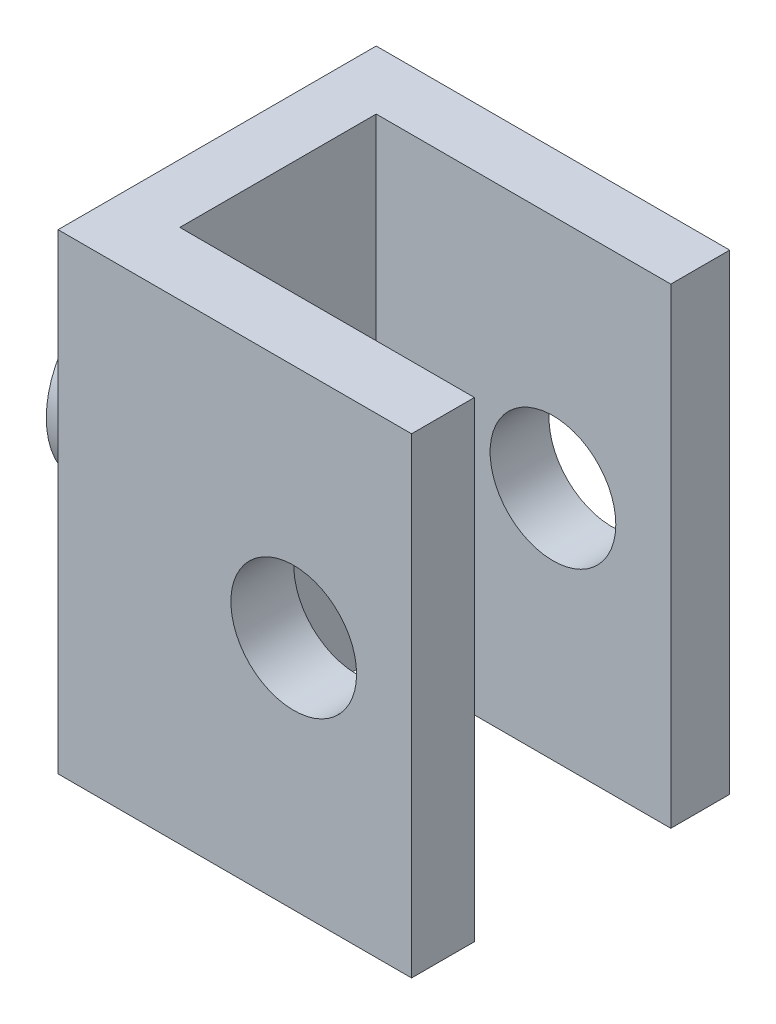
ISO-10303-21;
HEADER;
FILE_DESCRIPTION(('STEP AP214'),'2;1');
FILE_NAME('part.step','',(''),(''),'','','');
FILE_SCHEMA(('AUTOMOTIVE_DESIGN { 1 0 10303 214 1 1 1 1 }'));
ENDSEC;
DATA;
#1=APPLICATION_CONTEXT('core data for automotive mechanical design processes');
#2=APPLICATION_PROTOCOL_DEFINITION('international standard','automotive_design',2000,#1);
#3=PRODUCT_CONTEXT('',#1,'mechanical');
#4=PRODUCT('Part','Part','',(#3));
#5=PRODUCT_RELATED_PRODUCT_CATEGORY('part','',(#4));
#6=PRODUCT_DEFINITION_FORMATION('','',#4);
#7=PRODUCT_DEFINITION_CONTEXT('part definition',#1,'design');
#8=PRODUCT_DEFINITION('design','',#6,#7);
#9=PRODUCT_DEFINITION_SHAPE('','',#8);
#10=(LENGTH_UNIT() NAMED_UNIT(*) SI_UNIT(.MILLI.,.METRE.));
#11=(NAMED_UNIT(*) PLANE_ANGLE_UNIT() SI_UNIT($,.RADIAN.));
#12=(NAMED_UNIT(*) SI_UNIT($,.STERADIAN.) SOLID_ANGLE_UNIT());
#13=UNCERTAINTY_MEASURE_WITH_UNIT(LENGTH_MEASURE(1.E-05),#10,'distance_accuracy_value','');
#14=(GEOMETRIC_REPRESENTATION_CONTEXT(3) GLOBAL_UNCERTAINTY_ASSIGNED_CONTEXT((#13)) GLOBAL_UNIT_ASSIGNED_CONTEXT((#10,
#11,#12)) REPRESENTATION_CONTEXT('',''));
#15=CARTESIAN_POINT('',(0.,0.,0.));
#16=DIRECTION('',(0.,0.,1.));
#17=DIRECTION('',(1.,0.,0.));
#18=AXIS2_PLACEMENT_3D('',#15,#16,#17);
#19=CARTESIAN_POINT('',(-40.7916512459885,-18.,19.1));
#20=DIRECTION('',(-1.,0.,0.));
#21=DIRECTION('',(0.,0.,1.));
#22=AXIS2_PLACEMENT_3D('',#19,#20,#21);
#23=PLANE('',#22);
#24=DIRECTION('',(0.,1.,0.));
#25=VECTOR('',#24,1.);
#26=CARTESIAN_POINT('',(-40.7916512459885,-18.,17.5));
#27=LINE('',#26,#25);
#28=CARTESIAN_POINT('',(-40.7916512459885,-18.,17.5));
#29=VERTEX_POINT('',#28);
#30=CARTESIAN_POINT('',(-40.7916512459885,-6.,17.5));
#31=VERTEX_POINT('',#30);
#32=EDGE_CURVE('E59',#29,#31,#27,.T.);
#33=ORIENTED_EDGE('',*,*,#32,.F.);
#34=DIRECTION('',(0.,0.,-1.));
#35=VECTOR('',#34,1.);
#36=CARTESIAN_POINT('',(-40.7916512459885,-18.,19.1));
#37=LINE('',#36,#35);
#38=CARTESIAN_POINT('',(-40.7916512459885,-18.,12.5));
#39=VERTEX_POINT('',#38);
#40=EDGE_CURVE('E173',#29,#39,#37,.T.);
#41=ORIENTED_EDGE('',*,*,#40,.T.);
#42=DIRECTION('',(0.,1.,0.));
#43=VECTOR('',#42,1.);
#44=CARTESIAN_POINT('',(-40.7916512459885,-18.,12.5));
#45=LINE('',#44,#43);
#46=CARTESIAN_POINT('',(-40.7916512459885,-6.,12.5));
#47=VERTEX_POINT('',#46);
#48=EDGE_CURVE('E49',#39,#47,#45,.T.);
#49=ORIENTED_EDGE('',*,*,#48,.T.);
#50=DIRECTION('',(0.,0.,-1.));
#51=VECTOR('',#50,1.);
#52=CARTESIAN_POINT('',(-40.7916512459885,-6.,19.1));
#53=LINE('',#52,#51);
#54=EDGE_CURVE('E63',#31,#47,#53,.T.);
#55=ORIENTED_EDGE('',*,*,#54,.F.);
#56=EDGE_LOOP('',(#33,#41,#49,#55));
#57=FACE_BOUND('',#56,.T.);
#58=ADVANCED_FACE('F41',(#57),#23,.F.);
#59=CARTESIAN_POINT('',(-42.2916512459885,-6.,19.1));
#60=DIRECTION('',(1.,0.,0.));
#61=DIRECTION('',(0.,0.,-1.));
#62=AXIS2_PLACEMENT_3D('',#59,#60,#61);
#63=PLANE('',#62);
#64=CARTESIAN_POINT('',(-42.2916512459885,-12.,15.));
#65=DIRECTION('',(1.,0.,0.));
#66=DIRECTION('',(0.,0.,-1.));
#67=AXIS2_PLACEMENT_3D('',#64,#65,#66);
#68=CIRCLE('',#67,2.4);
#69=CARTESIAN_POINT('',(-42.2916512459885,-12.,12.6));
#70=VERTEX_POINT('',#69);
#71=EDGE_CURVE('E11',#70,#70,#68,.F.);
#72=ORIENTED_EDGE('',*,*,#71,.F.);
#73=EDGE_LOOP('',(#72));
#74=FACE_BOUND('',#73,.T.);
#75=DIRECTION('',(0.,-1.,0.));
#76=VECTOR('',#75,1.);
#77=CARTESIAN_POINT('',(-42.2916512459885,-6.,11.));
#78=LINE('',#77,#76);
#79=CARTESIAN_POINT('',(-42.2916512459885,-6.,11.));
#80=VERTEX_POINT('',#79);
#81=CARTESIAN_POINT('',(-42.2916512459885,-18.,11.));
#82=VERTEX_POINT('',#81);
#83=EDGE_CURVE('E159',#80,#82,#78,.T.);
#84=ORIENTED_EDGE('',*,*,#83,.T.);
#85=DIRECTION('',(0.,0.,-1.));
#86=VECTOR('',#85,1.);
#87=CARTESIAN_POINT('',(-42.2916512459885,-18.,19.1));
#88=LINE('',#87,#86);
#89=CARTESIAN_POINT('',(-42.2916512459885,-18.,19.1));
#90=VERTEX_POINT('',#89);
#91=EDGE_CURVE('E174',#90,#82,#88,.T.);
#92=ORIENTED_EDGE('',*,*,#91,.F.);
#93=DIRECTION('',(0.,-1.,0.));
#94=VECTOR('',#93,1.);
#95=CARTESIAN_POINT('',(-42.2916512459885,-6.,19.1));
#96=LINE('',#95,#94);
#97=CARTESIAN_POINT('',(-42.2916512459885,-6.,19.1));
#98=VERTEX_POINT('',#97);
#99=EDGE_CURVE('E116',#98,#90,#96,.T.);
#100=ORIENTED_EDGE('',*,*,#99,.F.);
#101=DIRECTION('',(0.,0.,-1.));
#102=VECTOR('',#101,1.);
#103=CARTESIAN_POINT('',(-42.2916512459885,-6.,19.1));
#104=LINE('',#103,#102);
#105=EDGE_CURVE('E165',#98,#80,#104,.T.);
#106=ORIENTED_EDGE('',*,*,#105,.T.);
#107=EDGE_LOOP('',(#84,#92,#100,#106));
#108=FACE_BOUND('',#107,.T.);
#109=ADVANCED_FACE('F43',(#74,#108),#63,.F.);
#110=CARTESIAN_POINT('',(-42.2916512459885,-18.,19.1));
#111=DIRECTION('',(0.,1.,0.));
#112=DIRECTION('',(0.,0.,1.));
#113=AXIS2_PLACEMENT_3D('',#110,#111,#112);
#114=PLANE('',#113);
#115=ORIENTED_EDGE('',*,*,#40,.F.);
#116=DIRECTION('',(1.,0.,0.));
#117=VECTOR('',#116,1.);
#118=CARTESIAN_POINT('',(-40.8916512459885,-18.,17.5));
#119=LINE('',#118,#117);
#120=CARTESIAN_POINT('',(-33.2916512459885,-18.,17.5));
#121=VERTEX_POINT('',#120);
#122=EDGE_CURVE('E127',#29,#121,#119,.T.);
#123=ORIENTED_EDGE('',*,*,#122,.T.);
#124=DIRECTION('',(0.,0.,-1.));
#125=VECTOR('',#124,1.);
#126=CARTESIAN_POINT('',(-33.2916512459885,-18.,19.1));
#127=LINE('',#126,#125);
#128=CARTESIAN_POINT('',(-33.2916512459885,-18.,19.1));
#129=VERTEX_POINT('',#128);
#130=EDGE_CURVE('E124',#129,#121,#127,.T.);
#131=ORIENTED_EDGE('',*,*,#130,.F.);
#132=DIRECTION('',(1.,0.,0.));
#133=VECTOR('',#132,1.);
#134=CARTESIAN_POINT('',(-42.2916512459885,-18.,19.1));
#135=LINE('',#134,#133);
#136=EDGE_CURVE('E107',#90,#129,#135,.T.);
#137=ORIENTED_EDGE('',*,*,#136,.F.);
#138=ORIENTED_EDGE('',*,*,#91,.T.);
#139=DIRECTION('',(1.,0.,0.));
#140=VECTOR('',#139,1.);
#141=CARTESIAN_POINT('',(-42.2916512459885,-18.,11.));
#142=LINE('',#141,#140);
#143=CARTESIAN_POINT('',(-33.2916512459885,-18.,11.));
#144=VERTEX_POINT('',#143);
#145=EDGE_CURVE('E170',#82,#144,#142,.T.);
#146=ORIENTED_EDGE('',*,*,#145,.T.);
#147=DIRECTION('',(0.,0.,-1.));
#148=VECTOR('',#147,1.);
#149=CARTESIAN_POINT('',(-33.2916512459885,-18.,12.5));
#150=LINE('',#149,#148);
#151=CARTESIAN_POINT('',(-33.2916512459885,-18.,12.5));
#152=VERTEX_POINT('',#151);
#153=EDGE_CURVE('E160',#152,#144,#150,.T.);
#154=ORIENTED_EDGE('',*,*,#153,.F.);
#155=DIRECTION('',(1.,0.,0.));
#156=VECTOR('',#155,1.);
#157=CARTESIAN_POINT('',(-40.8916512459885,-18.,12.5));
#158=LINE('',#157,#156);
#159=EDGE_CURVE('E147',#39,#152,#158,.T.);
#160=ORIENTED_EDGE('',*,*,#159,.F.);
#161=EDGE_LOOP('',(#115,#123,#131,#137,#138,#146,#154,#160));
#162=FACE_BOUND('',#161,.T.);
#163=ADVANCED_FACE('F121',(#162),#114,.F.);
#164=CARTESIAN_POINT('',(-40.7916512459885,-6.,19.1));
#165=DIRECTION('',(0.,-1.,0.));
#166=DIRECTION('',(0.,0.,-1.));
#167=AXIS2_PLACEMENT_3D('',#164,#165,#166);
#168=PLANE('',#167);
#169=DIRECTION('',(-1.,0.,0.));
#170=VECTOR('',#169,1.);
#171=CARTESIAN_POINT('',(-40.7916512459885,-6.,19.1));
#172=LINE('',#171,#170);
#173=CARTESIAN_POINT('',(-33.2916512459885,-6.,19.1));
#174=VERTEX_POINT('',#173);
#175=EDGE_CURVE('E119',#174,#98,#172,.T.);
#176=ORIENTED_EDGE('',*,*,#175,.F.);
#177=DIRECTION('',(0.,0.,-1.));
#178=VECTOR('',#177,1.);
#179=CARTESIAN_POINT('',(-33.2916512459885,-6.,19.1));
#180=LINE('',#179,#178);
#181=CARTESIAN_POINT('',(-33.2916512459885,-6.,17.5));
#182=VERTEX_POINT('',#181);
#183=EDGE_CURVE('E126',#174,#182,#180,.T.);
#184=ORIENTED_EDGE('',*,*,#183,.T.);
#185=DIRECTION('',(-1.,0.,0.));
#186=VECTOR('',#185,1.);
#187=CARTESIAN_POINT('',(-33.2916512459885,-6.,17.5));
#188=LINE('',#187,#186);
#189=EDGE_CURVE('E135',#182,#31,#188,.T.);
#190=ORIENTED_EDGE('',*,*,#189,.T.);
#191=ORIENTED_EDGE('',*,*,#54,.T.);
#192=DIRECTION('',(-1.,0.,0.));
#193=VECTOR('',#192,1.);
#194=CARTESIAN_POINT('',(-33.2916512459885,-6.,12.5));
#195=LINE('',#194,#193);
#196=CARTESIAN_POINT('',(-33.2916512459885,-6.,12.5));
#197=VERTEX_POINT('',#196);
#198=EDGE_CURVE('E148',#197,#47,#195,.T.);
#199=ORIENTED_EDGE('',*,*,#198,.F.);
#200=DIRECTION('',(0.,0.,-1.));
#201=VECTOR('',#200,1.);
#202=CARTESIAN_POINT('',(-33.2916512459885,-6.,12.5));
#203=LINE('',#202,#201);
#204=CARTESIAN_POINT('',(-33.2916512459885,-6.,11.));
#205=VERTEX_POINT('',#204);
#206=EDGE_CURVE('E154',#197,#205,#203,.T.);
#207=ORIENTED_EDGE('',*,*,#206,.T.);
#208=DIRECTION('',(-1.,0.,0.));
#209=VECTOR('',#208,1.);
#210=CARTESIAN_POINT('',(-40.7916512459885,-6.,11.));
#211=LINE('',#210,#209);
#212=EDGE_CURVE('E163',#205,#80,#211,.T.);
#213=ORIENTED_EDGE('',*,*,#212,.T.);
#214=ORIENTED_EDGE('',*,*,#105,.F.);
#215=EDGE_LOOP('',(#176,#184,#190,#191,#199,#207,#213,#214));
#216=FACE_BOUND('',#215,.T.);
#217=ADVANCED_FACE('F209',(#216),#168,.F.);
#218=CARTESIAN_POINT('',(0.,0.,19.1));
#219=DIRECTION('',(0.,0.,1.));
#220=DIRECTION('',(1.,0.,0.));
#221=AXIS2_PLACEMENT_3D('',#218,#219,#220);
#222=PLANE('',#221);
#223=CARTESIAN_POINT('',(-36.2916512459885,-12.,19.1));
#224=DIRECTION('',(0.,0.,1.));
#225=DIRECTION('',(1.,0.,0.));
#226=AXIS2_PLACEMENT_3D('',#223,#224,#225);
#227=CIRCLE('',#226,1.6);
#228=CARTESIAN_POINT('',(-34.6916512459885,-12.,19.1));
#229=VERTEX_POINT('',#228);
#230=EDGE_CURVE('E184',#229,#229,#227,.F.);
#231=ORIENTED_EDGE('',*,*,#230,.T.);
#232=EDGE_LOOP('',(#231));
#233=FACE_BOUND('',#232,.T.);
#234=ORIENTED_EDGE('',*,*,#136,.T.);
#235=DIRECTION('',(0.,1.,0.));
#236=VECTOR('',#235,1.);
#237=CARTESIAN_POINT('',(-33.2916512459885,-18.,19.1));
#238=LINE('',#237,#236);
#239=EDGE_CURVE('E113',#129,#174,#238,.T.);
#240=ORIENTED_EDGE('',*,*,#239,.T.);
#241=ORIENTED_EDGE('',*,*,#175,.T.);
#242=ORIENTED_EDGE('',*,*,#99,.T.);
#243=EDGE_LOOP('',(#234,#240,#241,#242));
#244=FACE_BOUND('',#243,.T.);
#245=ADVANCED_FACE('F111',(#233,#244),#222,.T.);
#246=CARTESIAN_POINT('',(0.,0.,11.));
#247=DIRECTION('',(0.,0.,1.));
#248=DIRECTION('',(1.,0.,0.));
#249=AXIS2_PLACEMENT_3D('',#246,#247,#248);
#250=PLANE('',#249);
#251=CARTESIAN_POINT('',(-36.2916512459885,-12.,11.));
#252=DIRECTION('',(0.,0.,1.));
#253=DIRECTION('',(1.,0.,0.));
#254=AXIS2_PLACEMENT_3D('',#251,#252,#253);
#255=CIRCLE('',#254,1.6);
#256=CARTESIAN_POINT('',(-34.6916512459885,-12.,11.));
#257=VERTEX_POINT('',#256);
#258=EDGE_CURVE('E186',#257,#257,#255,.F.);
#259=ORIENTED_EDGE('',*,*,#258,.F.);
#260=EDGE_LOOP('',(#259));
#261=FACE_BOUND('',#260,.T.);
#262=ORIENTED_EDGE('',*,*,#83,.F.);
#263=ORIENTED_EDGE('',*,*,#212,.F.);
#264=DIRECTION('',(0.,1.,0.));
#265=VECTOR('',#264,1.);
#266=CARTESIAN_POINT('',(-33.2916512459885,-18.,11.));
#267=LINE('',#266,#265);
#268=EDGE_CURVE('E143',#144,#205,#267,.T.);
#269=ORIENTED_EDGE('',*,*,#268,.F.);
#270=ORIENTED_EDGE('',*,*,#145,.F.);
#271=EDGE_LOOP('',(#262,#263,#269,#270));
#272=FACE_BOUND('',#271,.T.);
#273=ADVANCED_FACE('F218',(#261,#272),#250,.F.);
#274=CARTESIAN_POINT('',(0.,0.,12.5));
#275=DIRECTION('',(0.,0.,1.));
#276=DIRECTION('',(1.,0.,0.));
#277=AXIS2_PLACEMENT_3D('',#274,#275,#276);
#278=PLANE('',#277);
#279=CARTESIAN_POINT('',(-36.2916512459885,-12.,12.5));
#280=DIRECTION('',(0.,0.,1.));
#281=DIRECTION('',(1.,0.,0.));
#282=AXIS2_PLACEMENT_3D('',#279,#280,#281);
#283=CIRCLE('',#282,1.6);
#284=CARTESIAN_POINT('',(-34.6916512459885,-12.,12.5));
#285=VERTEX_POINT('',#284);
#286=EDGE_CURVE('E191',#285,#285,#283,.F.);
#287=ORIENTED_EDGE('',*,*,#286,.T.);
#288=EDGE_LOOP('',(#287));
#289=FACE_BOUND('',#288,.T.);
#290=ORIENTED_EDGE('',*,*,#48,.F.);
#291=ORIENTED_EDGE('',*,*,#159,.T.);
#292=DIRECTION('',(0.,1.,0.));
#293=VECTOR('',#292,1.);
#294=CARTESIAN_POINT('',(-33.2916512459885,-18.,12.5));
#295=LINE('',#294,#293);
#296=EDGE_CURVE('E149',#152,#197,#295,.T.);
#297=ORIENTED_EDGE('',*,*,#296,.T.);
#298=ORIENTED_EDGE('',*,*,#198,.T.);
#299=EDGE_LOOP('',(#290,#291,#297,#298));
#300=FACE_BOUND('',#299,.T.);
#301=ADVANCED_FACE('F225',(#289,#300),#278,.T.);
#302=CARTESIAN_POINT('',(-33.2916512459885,-18.,12.5));
#303=DIRECTION('',(-1.,0.,0.));
#304=DIRECTION('',(0.,0.,1.));
#305=AXIS2_PLACEMENT_3D('',#302,#303,#304);
#306=PLANE('',#305);
#307=ORIENTED_EDGE('',*,*,#268,.T.);
#308=ORIENTED_EDGE('',*,*,#206,.F.);
#309=ORIENTED_EDGE('',*,*,#296,.F.);
#310=ORIENTED_EDGE('',*,*,#153,.T.);
#311=EDGE_LOOP('',(#307,#308,#309,#310));
#312=FACE_BOUND('',#311,.T.);
#313=ADVANCED_FACE('F207',(#312),#306,.F.);
#314=CARTESIAN_POINT('',(0.,0.,17.5));
#315=DIRECTION('',(0.,0.,1.));
#316=DIRECTION('',(1.,0.,0.));
#317=AXIS2_PLACEMENT_3D('',#314,#315,#316);
#318=PLANE('',#317);
#319=CARTESIAN_POINT('',(-36.2916512459885,-12.,17.5));
#320=DIRECTION('',(0.,0.,1.));
#321=DIRECTION('',(1.,0.,0.));
#322=AXIS2_PLACEMENT_3D('',#319,#320,#321);
#323=CIRCLE('',#322,1.6);
#324=CARTESIAN_POINT('',(-34.6916512459885,-12.,17.5));
#325=VERTEX_POINT('',#324);
#326=EDGE_CURVE('E44',#325,#325,#323,.F.);
#327=ORIENTED_EDGE('',*,*,#326,.F.);
#328=EDGE_LOOP('',(#327));
#329=FACE_BOUND('',#328,.T.);
#330=ORIENTED_EDGE('',*,*,#122,.F.);
#331=ORIENTED_EDGE('',*,*,#32,.T.);
#332=ORIENTED_EDGE('',*,*,#189,.F.);
#333=DIRECTION('',(0.,1.,0.));
#334=VECTOR('',#333,1.);
#335=CARTESIAN_POINT('',(-33.2916512459885,-18.,17.5));
#336=LINE('',#335,#334);
#337=EDGE_CURVE('E136',#121,#182,#336,.T.);
#338=ORIENTED_EDGE('',*,*,#337,.F.);
#339=EDGE_LOOP('',(#330,#331,#332,#338));
#340=FACE_BOUND('',#339,.T.);
#341=ADVANCED_FACE('F202',(#329,#340),#318,.F.);
#342=CARTESIAN_POINT('',(-33.2916512459885,-18.,19.1));
#343=DIRECTION('',(-1.,0.,0.));
#344=DIRECTION('',(0.,0.,1.));
#345=AXIS2_PLACEMENT_3D('',#342,#343,#344);
#346=PLANE('',#345);
#347=ORIENTED_EDGE('',*,*,#337,.T.);
#348=ORIENTED_EDGE('',*,*,#183,.F.);
#349=ORIENTED_EDGE('',*,*,#239,.F.);
#350=ORIENTED_EDGE('',*,*,#130,.T.);
#351=EDGE_LOOP('',(#347,#348,#349,#350));
#352=FACE_BOUND('',#351,.T.);
#353=ADVANCED_FACE('F132',(#352),#346,.F.);
#354=CARTESIAN_POINT('',(-42.1916512459885,-12.,15.));
#355=DIRECTION('',(-1.,0.,0.));
#356=DIRECTION('',(0.,0.,1.));
#357=AXIS2_PLACEMENT_3D('',#354,#355,#356);
#358=CYLINDRICAL_SURFACE('',#357,2.4);
#359=CARTESIAN_POINT('',(-44.2916512459885,-12.,15.));
#360=DIRECTION('',(1.,0.,0.));
#361=DIRECTION('',(0.,0.,-1.));
#362=AXIS2_PLACEMENT_3D('',#359,#360,#361);
#363=CIRCLE('',#362,2.4);
#364=CARTESIAN_POINT('',(-44.2916512459885,-12.,12.6));
#365=VERTEX_POINT('',#364);
#366=EDGE_CURVE('E139',#365,#365,#363,.T.);
#367=ORIENTED_EDGE('',*,*,#366,.T.);
#368=EDGE_LOOP('',(#367));
#369=FACE_BOUND('',#368,.T.);
#370=ORIENTED_EDGE('',*,*,#71,.T.);
#371=EDGE_LOOP('',(#370));
#372=FACE_BOUND('',#371,.T.);
#373=ADVANCED_FACE('F251',(#369,#372),#358,.T.);
#374=CARTESIAN_POINT('',(-44.2916512459885,-12.,15.));
#375=DIRECTION('',(1.,0.,0.));
#376=DIRECTION('',(0.,0.,-1.));
#377=AXIS2_PLACEMENT_3D('',#374,#375,#376);
#378=PLANE('',#377);
#379=CARTESIAN_POINT('',(-44.2916512459885,-12.,15.));
#380=DIRECTION('',(1.,0.,0.));
#381=DIRECTION('',(0.,0.,-1.));
#382=AXIS2_PLACEMENT_3D('',#379,#380,#381);
#383=CIRCLE('',#382,0.750000000000001);
#384=CARTESIAN_POINT('',(-44.2916512459885,-12.,14.25));
#385=VERTEX_POINT('',#384);
#386=EDGE_CURVE('E178',#385,#385,#383,.F.);
#387=ORIENTED_EDGE('',*,*,#386,.F.);
#388=EDGE_LOOP('',(#387));
#389=FACE_BOUND('',#388,.T.);
#390=ORIENTED_EDGE('',*,*,#366,.F.);
#391=EDGE_LOOP('',(#390));
#392=FACE_BOUND('',#391,.T.);
#393=ADVANCED_FACE('F269',(#389,#392),#378,.F.);
#394=CARTESIAN_POINT('',(-42.2416512459885,-12.,15.));
#395=DIRECTION('',(-1.,0.,0.));
#396=DIRECTION('',(0.,0.,1.));
#397=AXIS2_PLACEMENT_3D('',#394,#395,#396);
#398=CYLINDRICAL_SURFACE('',#397,0.750000000000001);
#399=CARTESIAN_POINT('',(-42.2416512459885,-12.,15.));
#400=DIRECTION('',(1.,0.,0.));
#401=DIRECTION('',(0.,0.,-1.));
#402=AXIS2_PLACEMENT_3D('',#399,#400,#401);
#403=CIRCLE('',#402,0.750000000000001);
#404=CARTESIAN_POINT('',(-42.2416512459885,-12.,14.25));
#405=VERTEX_POINT('',#404);
#406=EDGE_CURVE('E179',#405,#405,#403,.T.);
#407=ORIENTED_EDGE('',*,*,#406,.T.);
#408=EDGE_LOOP('',(#407));
#409=FACE_BOUND('',#408,.T.);
#410=ORIENTED_EDGE('',*,*,#386,.T.);
#411=EDGE_LOOP('',(#410));
#412=FACE_BOUND('',#411,.T.);
#413=ADVANCED_FACE('F276',(#409,#412),#398,.F.);
#414=CARTESIAN_POINT('',(-42.2416512459885,-12.,15.));
#415=DIRECTION('',(1.,0.,0.));
#416=DIRECTION('',(0.,0.,-1.));
#417=AXIS2_PLACEMENT_3D('',#414,#415,#416);
#418=PLANE('',#417);
#419=ORIENTED_EDGE('',*,*,#406,.F.);
#420=EDGE_LOOP('',(#419));
#421=FACE_BOUND('',#420,.T.);
#422=ADVANCED_FACE('F287',(#421),#418,.F.);
#423=CARTESIAN_POINT('',(-36.2916512459885,-12.,19.2));
#424=DIRECTION('',(0.,0.,-1.));
#425=DIRECTION('',(-1.,0.,0.));
#426=AXIS2_PLACEMENT_3D('',#423,#424,#425);
#427=CYLINDRICAL_SURFACE('',#426,1.6);
#428=ORIENTED_EDGE('',*,*,#230,.F.);
#429=EDGE_LOOP('',(#428));
#430=FACE_BOUND('',#429,.T.);
#431=ORIENTED_EDGE('',*,*,#326,.T.);
#432=EDGE_LOOP('',(#431));
#433=FACE_BOUND('',#432,.T.);
#434=ADVANCED_FACE('F201',(#430,#433),#427,.F.);
#435=ORIENTED_EDGE('',*,*,#286,.F.);
#436=EDGE_LOOP('',(#435));
#437=FACE_BOUND('',#436,.T.);
#438=ORIENTED_EDGE('',*,*,#258,.T.);
#439=EDGE_LOOP('',(#438));
#440=FACE_BOUND('',#439,.T.);
#441=ADVANCED_FACE('F318',(#437,#440),#427,.F.);
#442=CLOSED_SHELL('',(#58,#109,#163,#217,#245,#273,#301,#313,#341,#353,#373,#393,#413,#422,#434,#441));
#443=MANIFOLD_SOLID_BREP('B2',#442);
#444=ADVANCED_BREP_SHAPE_REPRESENTATION('',(#18,#443),#14);
#445=SHAPE_DEFINITION_REPRESENTATION(#9,#444);
ENDSEC;
END-ISO-10303-21;
